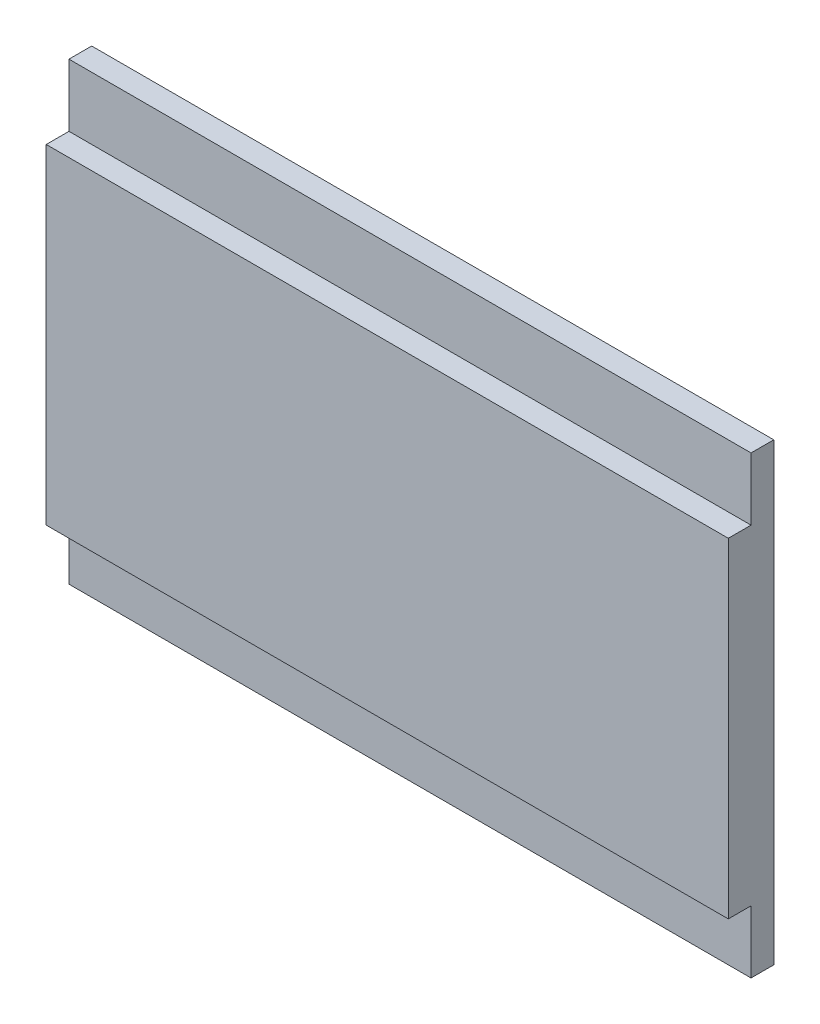
ISO-10303-21;
HEADER;
FILE_DESCRIPTION(('STEP AP214'),'2;1');
FILE_NAME('part.step','',(''),(''),'','','');
FILE_SCHEMA(('AUTOMOTIVE_DESIGN { 1 0 10303 214 1 1 1 1 }'));
ENDSEC;
DATA;
#1=APPLICATION_CONTEXT('core data for automotive mechanical design processes');
#2=APPLICATION_PROTOCOL_DEFINITION('international standard','automotive_design',2000,#1);
#3=PRODUCT_CONTEXT('',#1,'mechanical');
#4=PRODUCT('Part','Part','',(#3));
#5=PRODUCT_RELATED_PRODUCT_CATEGORY('part','',(#4));
#6=PRODUCT_DEFINITION_FORMATION('','',#4);
#7=PRODUCT_DEFINITION_CONTEXT('part definition',#1,'design');
#8=PRODUCT_DEFINITION('design','',#6,#7);
#9=PRODUCT_DEFINITION_SHAPE('','',#8);
#10=(LENGTH_UNIT() NAMED_UNIT(*) SI_UNIT(.MILLI.,.METRE.));
#11=(NAMED_UNIT(*) PLANE_ANGLE_UNIT() SI_UNIT($,.RADIAN.));
#12=(NAMED_UNIT(*) SI_UNIT($,.STERADIAN.) SOLID_ANGLE_UNIT());
#13=UNCERTAINTY_MEASURE_WITH_UNIT(LENGTH_MEASURE(1.E-05),#10,'distance_accuracy_value','');
#14=(GEOMETRIC_REPRESENTATION_CONTEXT(3) GLOBAL_UNCERTAINTY_ASSIGNED_CONTEXT((#13)) GLOBAL_UNIT_ASSIGNED_CONTEXT((#10,
#11,#12)) REPRESENTATION_CONTEXT('',''));
#15=CARTESIAN_POINT('',(0.,0.,0.));
#16=DIRECTION('',(0.,0.,1.));
#17=DIRECTION('',(1.,0.,0.));
#18=AXIS2_PLACEMENT_3D('',#15,#16,#17);
#19=CARTESIAN_POINT('',(0.,0.,10.));
#20=DIRECTION('',(0.,0.,-1.));
#21=DIRECTION('',(-1.,0.,0.));
#22=AXIS2_PLACEMENT_3D('',#19,#20,#21);
#23=PLANE('',#22);
#24=DIRECTION('',(-1.,0.,0.));
#25=VECTOR('',#24,1.);
#26=CARTESIAN_POINT('',(0.,172.5,10.));
#27=LINE('',#26,#25);
#28=CARTESIAN_POINT('',(300.,172.5,10.));
#29=VERTEX_POINT('',#28);
#30=CARTESIAN_POINT('',(0.,172.5,10.));
#31=VERTEX_POINT('',#30);
#32=EDGE_CURVE('E142',#29,#31,#27,.T.);
#33=ORIENTED_EDGE('',*,*,#32,.F.);
#34=DIRECTION('',(0.,1.,0.));
#35=VECTOR('',#34,1.);
#36=CARTESIAN_POINT('',(300.,0.,10.));
#37=LINE('',#36,#35);
#38=CARTESIAN_POINT('',(300.,200.,10.));
#39=VERTEX_POINT('',#38);
#40=EDGE_CURVE('E150',#29,#39,#37,.T.);
#41=ORIENTED_EDGE('',*,*,#40,.T.);
#42=DIRECTION('',(1.,0.,0.));
#43=VECTOR('',#42,1.);
#44=CARTESIAN_POINT('',(0.,200.,10.));
#45=LINE('',#44,#43);
#46=CARTESIAN_POINT('',(0.,200.,10.));
#47=VERTEX_POINT('',#46);
#48=EDGE_CURVE('E147',#47,#39,#45,.T.);
#49=ORIENTED_EDGE('',*,*,#48,.F.);
#50=DIRECTION('',(0.,1.,0.));
#51=VECTOR('',#50,1.);
#52=CARTESIAN_POINT('',(0.,0.,10.));
#53=LINE('',#52,#51);
#54=EDGE_CURVE('E88',#31,#47,#53,.T.);
#55=ORIENTED_EDGE('',*,*,#54,.F.);
#56=EDGE_LOOP('',(#33,#41,#49,#55));
#57=FACE_BOUND('',#56,.T.);
#58=ADVANCED_FACE('F39',(#57),#23,.F.);
#59=CARTESIAN_POINT('',(0.,0.,10.));
#60=DIRECTION('',(-1.,0.,0.));
#61=DIRECTION('',(0.,-1.,0.));
#62=AXIS2_PLACEMENT_3D('',#59,#60,#61);
#63=PLANE('',#62);
#64=CARTESIAN_POINT('',(0.,0.,10.));
#65=VERTEX_POINT('',#64);
#66=CARTESIAN_POINT('',(0.,27.5,10.));
#67=VERTEX_POINT('',#66);
#68=EDGE_CURVE('E145',#65,#67,#53,.T.);
#69=ORIENTED_EDGE('',*,*,#68,.T.);
#70=DIRECTION('',(0.,0.,-1.));
#71=VECTOR('',#70,1.);
#72=CARTESIAN_POINT('',(0.,27.5,20.));
#73=LINE('',#72,#71);
#74=CARTESIAN_POINT('',(0.,27.5,20.));
#75=VERTEX_POINT('',#74);
#76=EDGE_CURVE('E56',#75,#67,#73,.T.);
#77=ORIENTED_EDGE('',*,*,#76,.F.);
#78=DIRECTION('',(0.,-1.,0.));
#79=VECTOR('',#78,1.);
#80=CARTESIAN_POINT('',(0.,172.5,20.));
#81=LINE('',#80,#79);
#82=CARTESIAN_POINT('',(0.,172.5,20.));
#83=VERTEX_POINT('',#82);
#84=EDGE_CURVE('E127',#83,#75,#81,.T.);
#85=ORIENTED_EDGE('',*,*,#84,.F.);
#86=DIRECTION('',(0.,0.,-1.));
#87=VECTOR('',#86,1.);
#88=CARTESIAN_POINT('',(0.,172.5,20.));
#89=LINE('',#88,#87);
#90=EDGE_CURVE('E138',#83,#31,#89,.T.);
#91=ORIENTED_EDGE('',*,*,#90,.T.);
#92=ORIENTED_EDGE('',*,*,#54,.T.);
#93=DIRECTION('',(0.,0.,-1.));
#94=VECTOR('',#93,1.);
#95=CARTESIAN_POINT('',(0.,200.,10.));
#96=LINE('',#95,#94);
#97=CARTESIAN_POINT('',(0.,200.,0.));
#98=VERTEX_POINT('',#97);
#99=EDGE_CURVE('E43',#47,#98,#96,.T.);
#100=ORIENTED_EDGE('',*,*,#99,.T.);
#101=DIRECTION('',(0.,1.,0.));
#102=VECTOR('',#101,1.);
#103=CARTESIAN_POINT('',(0.,0.,0.));
#104=LINE('',#103,#102);
#105=CARTESIAN_POINT('',(0.,0.,0.));
#106=VERTEX_POINT('',#105);
#107=EDGE_CURVE('E144',#106,#98,#104,.T.);
#108=ORIENTED_EDGE('',*,*,#107,.F.);
#109=DIRECTION('',(0.,0.,-1.));
#110=VECTOR('',#109,1.);
#111=CARTESIAN_POINT('',(0.,0.,10.));
#112=LINE('',#111,#110);
#113=EDGE_CURVE('E11',#65,#106,#112,.T.);
#114=ORIENTED_EDGE('',*,*,#113,.F.);
#115=EDGE_LOOP('',(#69,#77,#85,#91,#92,#100,#108,#114));
#116=FACE_BOUND('',#115,.T.);
#117=ADVANCED_FACE('F41',(#116),#63,.T.);
#118=CARTESIAN_POINT('',(0.,0.,10.));
#119=DIRECTION('',(0.,1.,0.));
#120=DIRECTION('',(0.,0.,1.));
#121=AXIS2_PLACEMENT_3D('',#118,#119,#120);
#122=PLANE('',#121);
#123=DIRECTION('',(1.,0.,0.));
#124=VECTOR('',#123,1.);
#125=CARTESIAN_POINT('',(0.,0.,0.));
#126=LINE('',#125,#124);
#127=CARTESIAN_POINT('',(300.,0.,0.));
#128=VERTEX_POINT('',#127);
#129=EDGE_CURVE('E161',#106,#128,#126,.T.);
#130=ORIENTED_EDGE('',*,*,#129,.T.);
#131=DIRECTION('',(0.,0.,-1.));
#132=VECTOR('',#131,1.);
#133=CARTESIAN_POINT('',(300.,0.,10.));
#134=LINE('',#133,#132);
#135=CARTESIAN_POINT('',(300.,0.,10.));
#136=VERTEX_POINT('',#135);
#137=EDGE_CURVE('E48',#136,#128,#134,.T.);
#138=ORIENTED_EDGE('',*,*,#137,.F.);
#139=DIRECTION('',(1.,0.,0.));
#140=VECTOR('',#139,1.);
#141=CARTESIAN_POINT('',(0.,0.,10.));
#142=LINE('',#141,#140);
#143=EDGE_CURVE('E153',#65,#136,#142,.T.);
#144=ORIENTED_EDGE('',*,*,#143,.F.);
#145=ORIENTED_EDGE('',*,*,#113,.T.);
#146=EDGE_LOOP('',(#130,#138,#144,#145));
#147=FACE_BOUND('',#146,.T.);
#148=ADVANCED_FACE('F175',(#147),#122,.F.);
#149=CARTESIAN_POINT('',(300.,0.,10.));
#150=DIRECTION('',(-1.,0.,0.));
#151=DIRECTION('',(0.,-1.,0.));
#152=AXIS2_PLACEMENT_3D('',#149,#150,#151);
#153=PLANE('',#152);
#154=DIRECTION('',(0.,1.,0.));
#155=VECTOR('',#154,1.);
#156=CARTESIAN_POINT('',(300.,0.,0.));
#157=LINE('',#156,#155);
#158=CARTESIAN_POINT('',(300.,200.,0.));
#159=VERTEX_POINT('',#158);
#160=EDGE_CURVE('E159',#128,#159,#157,.T.);
#161=ORIENTED_EDGE('',*,*,#160,.T.);
#162=DIRECTION('',(0.,0.,-1.));
#163=VECTOR('',#162,1.);
#164=CARTESIAN_POINT('',(300.,200.,10.));
#165=LINE('',#164,#163);
#166=EDGE_CURVE('E164',#39,#159,#165,.T.);
#167=ORIENTED_EDGE('',*,*,#166,.F.);
#168=ORIENTED_EDGE('',*,*,#40,.F.);
#169=DIRECTION('',(0.,0.,-1.));
#170=VECTOR('',#169,1.);
#171=CARTESIAN_POINT('',(300.,172.5,20.));
#172=LINE('',#171,#170);
#173=CARTESIAN_POINT('',(300.,172.5,20.));
#174=VERTEX_POINT('',#173);
#175=EDGE_CURVE('E131',#174,#29,#172,.T.);
#176=ORIENTED_EDGE('',*,*,#175,.F.);
#177=DIRECTION('',(0.,-1.,0.));
#178=VECTOR('',#177,1.);
#179=CARTESIAN_POINT('',(300.,172.5,20.));
#180=LINE('',#179,#178);
#181=CARTESIAN_POINT('',(300.,27.5000000000001,20.));
#182=VERTEX_POINT('',#181);
#183=EDGE_CURVE('E125',#174,#182,#180,.T.);
#184=ORIENTED_EDGE('',*,*,#183,.T.);
#185=DIRECTION('',(0.,0.,-1.));
#186=VECTOR('',#185,1.);
#187=CARTESIAN_POINT('',(300.,27.5000000000001,20.));
#188=LINE('',#187,#186);
#189=CARTESIAN_POINT('',(300.,27.5000000000001,10.));
#190=VERTEX_POINT('',#189);
#191=EDGE_CURVE('E111',#182,#190,#188,.T.);
#192=ORIENTED_EDGE('',*,*,#191,.T.);
#193=EDGE_CURVE('E151',#136,#190,#37,.T.);
#194=ORIENTED_EDGE('',*,*,#193,.F.);
#195=ORIENTED_EDGE('',*,*,#137,.T.);
#196=EDGE_LOOP('',(#161,#167,#168,#176,#184,#192,#194,#195));
#197=FACE_BOUND('',#196,.T.);
#198=ADVANCED_FACE('F129',(#197),#153,.F.);
#199=CARTESIAN_POINT('',(0.,200.,10.));
#200=DIRECTION('',(0.,1.,0.));
#201=DIRECTION('',(0.,0.,1.));
#202=AXIS2_PLACEMENT_3D('',#199,#200,#201);
#203=PLANE('',#202);
#204=DIRECTION('',(1.,0.,0.));
#205=VECTOR('',#204,1.);
#206=CARTESIAN_POINT('',(0.,200.,0.));
#207=LINE('',#206,#205);
#208=EDGE_CURVE('E156',#98,#159,#207,.T.);
#209=ORIENTED_EDGE('',*,*,#208,.F.);
#210=ORIENTED_EDGE('',*,*,#99,.F.);
#211=ORIENTED_EDGE('',*,*,#48,.T.);
#212=ORIENTED_EDGE('',*,*,#166,.T.);
#213=EDGE_LOOP('',(#209,#210,#211,#212));
#214=FACE_BOUND('',#213,.T.);
#215=ADVANCED_FACE('F170',(#214),#203,.T.);
#216=ORIENTED_EDGE('',*,*,#193,.T.);
#217=DIRECTION('',(-1.,0.,0.));
#218=VECTOR('',#217,1.);
#219=CARTESIAN_POINT('',(0.,27.5,10.));
#220=LINE('',#219,#218);
#221=EDGE_CURVE('E115',#190,#67,#220,.T.);
#222=ORIENTED_EDGE('',*,*,#221,.T.);
#223=ORIENTED_EDGE('',*,*,#68,.F.);
#224=ORIENTED_EDGE('',*,*,#143,.T.);
#225=EDGE_LOOP('',(#216,#222,#223,#224));
#226=FACE_BOUND('',#225,.T.);
#227=ADVANCED_FACE('F177',(#226),#23,.F.);
#228=CARTESIAN_POINT('',(0.,0.,0.));
#229=DIRECTION('',(0.,0.,-1.));
#230=DIRECTION('',(-1.,0.,0.));
#231=AXIS2_PLACEMENT_3D('',#228,#229,#230);
#232=PLANE('',#231);
#233=ORIENTED_EDGE('',*,*,#107,.T.);
#234=ORIENTED_EDGE('',*,*,#208,.T.);
#235=ORIENTED_EDGE('',*,*,#160,.F.);
#236=ORIENTED_EDGE('',*,*,#129,.F.);
#237=EDGE_LOOP('',(#233,#234,#235,#236));
#238=FACE_BOUND('',#237,.T.);
#239=ADVANCED_FACE('F173',(#238),#232,.T.);
#240=CARTESIAN_POINT('',(300.,172.5,20.));
#241=DIRECTION('',(0.,-1.,0.));
#242=DIRECTION('',(0.,0.,-1.));
#243=AXIS2_PLACEMENT_3D('',#240,#241,#242);
#244=PLANE('',#243);
#245=ORIENTED_EDGE('',*,*,#175,.T.);
#246=ORIENTED_EDGE('',*,*,#32,.T.);
#247=ORIENTED_EDGE('',*,*,#90,.F.);
#248=DIRECTION('',(-1.,0.,0.));
#249=VECTOR('',#248,1.);
#250=CARTESIAN_POINT('',(300.,172.5,20.));
#251=LINE('',#250,#249);
#252=EDGE_CURVE('E120',#174,#83,#251,.T.);
#253=ORIENTED_EDGE('',*,*,#252,.F.);
#254=EDGE_LOOP('',(#245,#246,#247,#253));
#255=FACE_BOUND('',#254,.T.);
#256=ADVANCED_FACE('F183',(#255),#244,.F.);
#257=CARTESIAN_POINT('',(300.,27.5000000000001,20.));
#258=DIRECTION('',(0.,-1.,0.));
#259=DIRECTION('',(1.,0.,0.));
#260=AXIS2_PLACEMENT_3D('',#257,#258,#259);
#261=PLANE('',#260);
#262=ORIENTED_EDGE('',*,*,#221,.F.);
#263=ORIENTED_EDGE('',*,*,#191,.F.);
#264=DIRECTION('',(-1.,0.,0.));
#265=VECTOR('',#264,1.);
#266=CARTESIAN_POINT('',(300.,27.5000000000001,20.));
#267=LINE('',#266,#265);
#268=EDGE_CURVE('E114',#182,#75,#267,.T.);
#269=ORIENTED_EDGE('',*,*,#268,.T.);
#270=ORIENTED_EDGE('',*,*,#76,.T.);
#271=EDGE_LOOP('',(#262,#263,#269,#270));
#272=FACE_BOUND('',#271,.T.);
#273=ADVANCED_FACE('F113',(#272),#261,.T.);
#274=CARTESIAN_POINT('',(0.,0.,20.));
#275=DIRECTION('',(0.,0.,-1.));
#276=DIRECTION('',(-1.,0.,0.));
#277=AXIS2_PLACEMENT_3D('',#274,#275,#276);
#278=PLANE('',#277);
#279=ORIENTED_EDGE('',*,*,#183,.F.);
#280=ORIENTED_EDGE('',*,*,#252,.T.);
#281=ORIENTED_EDGE('',*,*,#84,.T.);
#282=ORIENTED_EDGE('',*,*,#268,.F.);
#283=EDGE_LOOP('',(#279,#280,#281,#282));
#284=FACE_BOUND('',#283,.T.);
#285=ADVANCED_FACE('F124',(#284),#278,.F.);
#286=CLOSED_SHELL('',(#58,#117,#148,#198,#215,#227,#239,#256,#273,#285));
#287=MANIFOLD_SOLID_BREP('B2',#286);
#288=ADVANCED_BREP_SHAPE_REPRESENTATION('',(#18,#287),#14);
#289=SHAPE_DEFINITION_REPRESENTATION(#9,#288);
ENDSEC;
END-ISO-10303-21;
